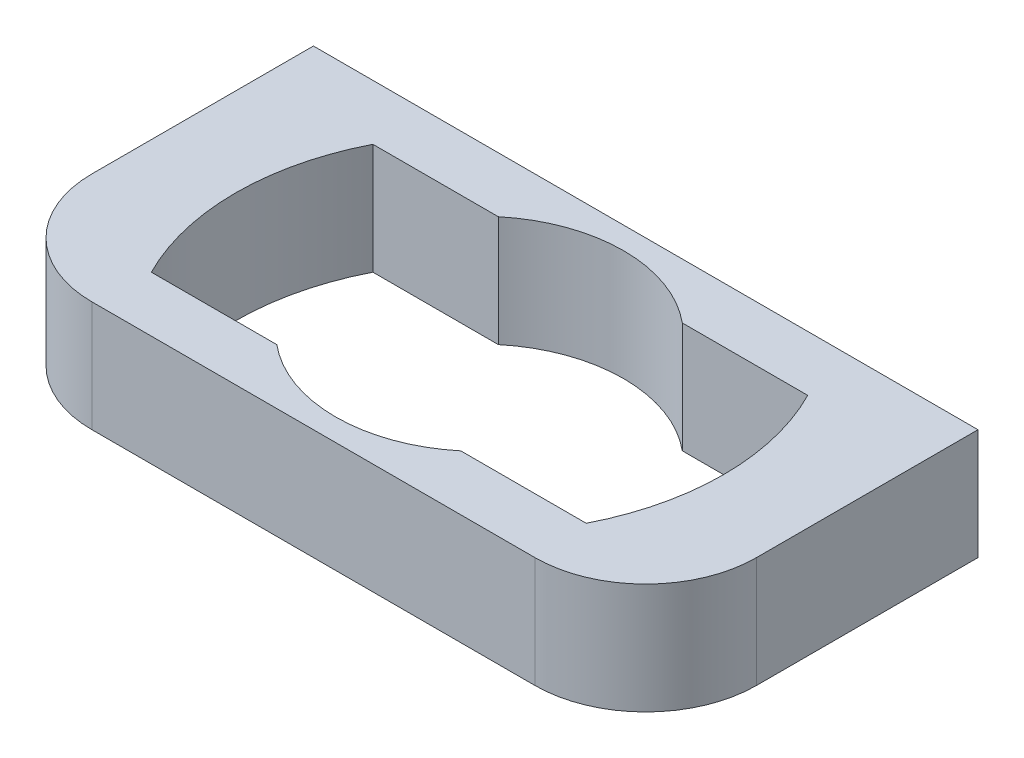
ISO-10303-21;
HEADER;
FILE_DESCRIPTION(('STEP AP214'),'2;1');
FILE_NAME('part.step','',(''),(''),'','','');
FILE_SCHEMA(('AUTOMOTIVE_DESIGN { 1 0 10303 214 1 1 1 1 }'));
ENDSEC;
DATA;
#1=APPLICATION_CONTEXT('core data for automotive mechanical design processes');
#2=APPLICATION_PROTOCOL_DEFINITION('international standard','automotive_design',2000,#1);
#3=PRODUCT_CONTEXT('',#1,'mechanical');
#4=PRODUCT('Part','Part','',(#3));
#5=PRODUCT_RELATED_PRODUCT_CATEGORY('part','',(#4));
#6=PRODUCT_DEFINITION_FORMATION('','',#4);
#7=PRODUCT_DEFINITION_CONTEXT('part definition',#1,'design');
#8=PRODUCT_DEFINITION('design','',#6,#7);
#9=PRODUCT_DEFINITION_SHAPE('','',#8);
#10=(LENGTH_UNIT() NAMED_UNIT(*) SI_UNIT(.MILLI.,.METRE.));
#11=(NAMED_UNIT(*) PLANE_ANGLE_UNIT() SI_UNIT($,.RADIAN.));
#12=(NAMED_UNIT(*) SI_UNIT($,.STERADIAN.) SOLID_ANGLE_UNIT());
#13=UNCERTAINTY_MEASURE_WITH_UNIT(LENGTH_MEASURE(1.E-05),#10,'distance_accuracy_value','');
#14=(GEOMETRIC_REPRESENTATION_CONTEXT(3) GLOBAL_UNCERTAINTY_ASSIGNED_CONTEXT((#13)) GLOBAL_UNIT_ASSIGNED_CONTEXT((#10,
#11,#12)) REPRESENTATION_CONTEXT('',''));
#15=CARTESIAN_POINT('',(0.,0.,0.));
#16=DIRECTION('',(0.,0.,1.));
#17=DIRECTION('',(1.,0.,0.));
#18=AXIS2_PLACEMENT_3D('',#15,#16,#17);
#19=CARTESIAN_POINT('',(0.,10.,0.));
#20=DIRECTION('',(0.,-1.,0.));
#21=DIRECTION('',(0.,0.,-1.));
#22=AXIS2_PLACEMENT_3D('',#19,#20,#21);
#23=CYLINDRICAL_SURFACE('',#22,22.03);
#24=CARTESIAN_POINT('',(0.,0.,0.));
#25=DIRECTION('',(0.,1.,0.));
#26=DIRECTION('',(0.,0.,1.));
#27=AXIS2_PLACEMENT_3D('',#24,#25,#26);
#28=CIRCLE('',#27,22.03);
#29=CARTESIAN_POINT('',(-19.6295924562891,0.,-10.));
#30=VERTEX_POINT('',#29);
#31=CARTESIAN_POINT('',(-19.629592456289,0.,10.));
#32=VERTEX_POINT('',#31);
#33=EDGE_CURVE('E222',#30,#32,#28,.T.);
#34=ORIENTED_EDGE('',*,*,#33,.F.);
#35=DIRECTION('',(0.,-1.,0.));
#36=VECTOR('',#35,1.);
#37=CARTESIAN_POINT('',(-19.6295924562891,10.,-10.));
#38=LINE('',#37,#36);
#39=CARTESIAN_POINT('',(-19.6295924562891,10.,-10.));
#40=VERTEX_POINT('',#39);
#41=EDGE_CURVE('E267',#40,#30,#38,.T.);
#42=ORIENTED_EDGE('',*,*,#41,.F.);
#43=CARTESIAN_POINT('',(0.,10.,0.));
#44=DIRECTION('',(0.,1.,0.));
#45=DIRECTION('',(0.,0.,1.));
#46=AXIS2_PLACEMENT_3D('',#43,#44,#45);
#47=CIRCLE('',#46,22.03);
#48=CARTESIAN_POINT('',(-19.629592456289,10.,10.));
#49=VERTEX_POINT('',#48);
#50=EDGE_CURVE('E184',#40,#49,#47,.T.);
#51=ORIENTED_EDGE('',*,*,#50,.T.);
#52=DIRECTION('',(0.,-1.,0.));
#53=VECTOR('',#52,1.);
#54=CARTESIAN_POINT('',(-19.629592456289,10.,10.));
#55=LINE('',#54,#53);
#56=EDGE_CURVE('E163',#49,#32,#55,.T.);
#57=ORIENTED_EDGE('',*,*,#56,.T.);
#58=EDGE_LOOP('',(#34,#42,#51,#57));
#59=FACE_BOUND('',#58,.T.);
#60=ADVANCED_FACE('F47',(#59),#23,.F.);
#61=CARTESIAN_POINT('',(0.,10.,-10.));
#62=DIRECTION('',(0.,0.,-1.));
#63=DIRECTION('',(-1.,0.,0.));
#64=AXIS2_PLACEMENT_3D('',#61,#62,#63);
#65=PLANE('',#64);
#66=DIRECTION('',(1.,0.,0.));
#67=VECTOR('',#66,1.);
#68=CARTESIAN_POINT('',(0.,0.,-10.));
#69=LINE('',#68,#67);
#70=CARTESIAN_POINT('',(-8.30662386291808,0.,-10.));
#71=VERTEX_POINT('',#70);
#72=EDGE_CURVE('E226',#30,#71,#69,.T.);
#73=ORIENTED_EDGE('',*,*,#72,.T.);
#74=DIRECTION('',(0.,-1.,0.));
#75=VECTOR('',#74,1.);
#76=CARTESIAN_POINT('',(-8.30662386291808,10.,-10.));
#77=LINE('',#76,#75);
#78=CARTESIAN_POINT('',(-8.30662386291808,10.,-10.));
#79=VERTEX_POINT('',#78);
#80=EDGE_CURVE('E264',#79,#71,#77,.T.);
#81=ORIENTED_EDGE('',*,*,#80,.F.);
#82=DIRECTION('',(1.,0.,0.));
#83=VECTOR('',#82,1.);
#84=CARTESIAN_POINT('',(0.,10.,-10.));
#85=LINE('',#84,#83);
#86=EDGE_CURVE('E188',#40,#79,#85,.T.);
#87=ORIENTED_EDGE('',*,*,#86,.F.);
#88=ORIENTED_EDGE('',*,*,#41,.T.);
#89=EDGE_LOOP('',(#73,#81,#87,#88));
#90=FACE_BOUND('',#89,.T.);
#91=ADVANCED_FACE('F315',(#90),#65,.F.);
#92=CARTESIAN_POINT('',(0.,10.,0.));
#93=DIRECTION('',(0.,-1.,0.));
#94=DIRECTION('',(0.,0.,-1.));
#95=AXIS2_PLACEMENT_3D('',#92,#93,#94);
#96=CYLINDRICAL_SURFACE('',#95,13.);
#97=CARTESIAN_POINT('',(0.,0.,0.));
#98=DIRECTION('',(0.,1.,0.));
#99=DIRECTION('',(0.,0.,1.));
#100=AXIS2_PLACEMENT_3D('',#97,#98,#99);
#101=CIRCLE('',#100,13.);
#102=CARTESIAN_POINT('',(8.30662386291808,0.,-10.));
#103=VERTEX_POINT('',#102);
#104=EDGE_CURVE('E230',#103,#71,#101,.T.);
#105=ORIENTED_EDGE('',*,*,#104,.F.);
#106=DIRECTION('',(0.,-1.,0.));
#107=VECTOR('',#106,1.);
#108=CARTESIAN_POINT('',(8.30662386291808,10.,-10.));
#109=LINE('',#108,#107);
#110=CARTESIAN_POINT('',(8.30662386291808,10.,-10.));
#111=VERTEX_POINT('',#110);
#112=EDGE_CURVE('E261',#111,#103,#109,.T.);
#113=ORIENTED_EDGE('',*,*,#112,.F.);
#114=CARTESIAN_POINT('',(0.,10.,0.));
#115=DIRECTION('',(0.,1.,0.));
#116=DIRECTION('',(0.,0.,1.));
#117=AXIS2_PLACEMENT_3D('',#114,#115,#116);
#118=CIRCLE('',#117,13.);
#119=EDGE_CURVE('E191',#111,#79,#118,.T.);
#120=ORIENTED_EDGE('',*,*,#119,.T.);
#121=ORIENTED_EDGE('',*,*,#80,.T.);
#122=EDGE_LOOP('',(#105,#113,#120,#121));
#123=FACE_BOUND('',#122,.T.);
#124=ADVANCED_FACE('F321',(#123),#96,.F.);
#125=CARTESIAN_POINT('',(19.6295924562891,0.,-10.));
#126=VERTEX_POINT('',#125);
#127=EDGE_CURVE('E231',#103,#126,#69,.T.);
#128=ORIENTED_EDGE('',*,*,#127,.T.);
#129=DIRECTION('',(0.,-1.,0.));
#130=VECTOR('',#129,1.);
#131=CARTESIAN_POINT('',(19.6295924562891,10.,-10.));
#132=LINE('',#131,#130);
#133=CARTESIAN_POINT('',(19.6295924562891,10.,-10.));
#134=VERTEX_POINT('',#133);
#135=EDGE_CURVE('E258',#134,#126,#132,.T.);
#136=ORIENTED_EDGE('',*,*,#135,.F.);
#137=EDGE_CURVE('E192',#111,#134,#85,.T.);
#138=ORIENTED_EDGE('',*,*,#137,.F.);
#139=ORIENTED_EDGE('',*,*,#112,.T.);
#140=EDGE_LOOP('',(#128,#136,#138,#139));
#141=FACE_BOUND('',#140,.T.);
#142=ADVANCED_FACE('F324',(#141),#65,.F.);
#143=CARTESIAN_POINT('',(0.,10.,0.));
#144=DIRECTION('',(0.,-1.,0.));
#145=DIRECTION('',(0.,0.,-1.));
#146=AXIS2_PLACEMENT_3D('',#143,#144,#145);
#147=CYLINDRICAL_SURFACE('',#146,22.03);
#148=CARTESIAN_POINT('',(0.,0.,0.));
#149=DIRECTION('',(0.,1.,0.));
#150=DIRECTION('',(0.,0.,1.));
#151=AXIS2_PLACEMENT_3D('',#148,#149,#150);
#152=CIRCLE('',#151,22.03);
#153=CARTESIAN_POINT('',(19.629592456289,0.,10.));
#154=VERTEX_POINT('',#153);
#155=EDGE_CURVE('E235',#154,#126,#152,.T.);
#156=ORIENTED_EDGE('',*,*,#155,.F.);
#157=DIRECTION('',(0.,-1.,0.));
#158=VECTOR('',#157,1.);
#159=CARTESIAN_POINT('',(19.629592456289,10.,10.));
#160=LINE('',#159,#158);
#161=CARTESIAN_POINT('',(19.629592456289,10.,10.));
#162=VERTEX_POINT('',#161);
#163=EDGE_CURVE('E255',#162,#154,#160,.T.);
#164=ORIENTED_EDGE('',*,*,#163,.F.);
#165=CARTESIAN_POINT('',(0.,10.,0.));
#166=DIRECTION('',(0.,1.,0.));
#167=DIRECTION('',(0.,0.,1.));
#168=AXIS2_PLACEMENT_3D('',#165,#166,#167);
#169=CIRCLE('',#168,22.03);
#170=EDGE_CURVE('E196',#162,#134,#169,.T.);
#171=ORIENTED_EDGE('',*,*,#170,.T.);
#172=ORIENTED_EDGE('',*,*,#135,.T.);
#173=EDGE_LOOP('',(#156,#164,#171,#172));
#174=FACE_BOUND('',#173,.T.);
#175=ADVANCED_FACE('F331',(#174),#147,.F.);
#176=CARTESIAN_POINT('',(0.,10.,10.));
#177=DIRECTION('',(0.,0.,-1.));
#178=DIRECTION('',(-1.,0.,0.));
#179=AXIS2_PLACEMENT_3D('',#176,#177,#178);
#180=PLANE('',#179);
#181=DIRECTION('',(1.,0.,0.));
#182=VECTOR('',#181,1.);
#183=CARTESIAN_POINT('',(0.,0.,10.));
#184=LINE('',#183,#182);
#185=CARTESIAN_POINT('',(8.30662386291807,0.,10.));
#186=VERTEX_POINT('',#185);
#187=EDGE_CURVE('E239',#186,#154,#184,.T.);
#188=ORIENTED_EDGE('',*,*,#187,.F.);
#189=DIRECTION('',(0.,-1.,0.));
#190=VECTOR('',#189,1.);
#191=CARTESIAN_POINT('',(8.30662386291807,10.,10.));
#192=LINE('',#191,#190);
#193=CARTESIAN_POINT('',(8.30662386291807,10.,10.));
#194=VERTEX_POINT('',#193);
#195=EDGE_CURVE('E252',#194,#186,#192,.T.);
#196=ORIENTED_EDGE('',*,*,#195,.F.);
#197=DIRECTION('',(1.,0.,0.));
#198=VECTOR('',#197,1.);
#199=CARTESIAN_POINT('',(0.,10.,10.));
#200=LINE('',#199,#198);
#201=EDGE_CURVE('E200',#194,#162,#200,.T.);
#202=ORIENTED_EDGE('',*,*,#201,.T.);
#203=ORIENTED_EDGE('',*,*,#163,.T.);
#204=EDGE_LOOP('',(#188,#196,#202,#203));
#205=FACE_BOUND('',#204,.T.);
#206=ADVANCED_FACE('F335',(#205),#180,.T.);
#207=CARTESIAN_POINT('',(0.,10.,0.));
#208=DIRECTION('',(0.,-1.,0.));
#209=DIRECTION('',(0.,0.,-1.));
#210=AXIS2_PLACEMENT_3D('',#207,#208,#209);
#211=CYLINDRICAL_SURFACE('',#210,13.);
#212=CARTESIAN_POINT('',(0.,0.,0.));
#213=DIRECTION('',(0.,1.,0.));
#214=DIRECTION('',(0.,0.,1.));
#215=AXIS2_PLACEMENT_3D('',#212,#213,#214);
#216=CIRCLE('',#215,13.);
#217=CARTESIAN_POINT('',(-8.30662386291807,0.,10.));
#218=VERTEX_POINT('',#217);
#219=EDGE_CURVE('E243',#218,#186,#216,.T.);
#220=ORIENTED_EDGE('',*,*,#219,.F.);
#221=DIRECTION('',(0.,-1.,0.));
#222=VECTOR('',#221,1.);
#223=CARTESIAN_POINT('',(-8.30662386291807,10.,10.));
#224=LINE('',#223,#222);
#225=CARTESIAN_POINT('',(-8.30662386291807,10.,10.));
#226=VERTEX_POINT('',#225);
#227=EDGE_CURVE('E249',#226,#218,#224,.T.);
#228=ORIENTED_EDGE('',*,*,#227,.F.);
#229=CARTESIAN_POINT('',(0.,10.,0.));
#230=DIRECTION('',(0.,1.,0.));
#231=DIRECTION('',(0.,0.,1.));
#232=AXIS2_PLACEMENT_3D('',#229,#230,#231);
#233=CIRCLE('',#232,13.);
#234=EDGE_CURVE('E204',#226,#194,#233,.T.);
#235=ORIENTED_EDGE('',*,*,#234,.T.);
#236=ORIENTED_EDGE('',*,*,#195,.T.);
#237=EDGE_LOOP('',(#220,#228,#235,#236));
#238=FACE_BOUND('',#237,.T.);
#239=ADVANCED_FACE('F337',(#238),#211,.F.);
#240=CARTESIAN_POINT('',(30.,10.,0.));
#241=DIRECTION('',(1.,0.,0.));
#242=DIRECTION('',(0.,0.,-1.));
#243=AXIS2_PLACEMENT_3D('',#240,#241,#242);
#244=PLANE('',#243);
#245=DIRECTION('',(0.,0.,1.));
#246=VECTOR('',#245,1.);
#247=CARTESIAN_POINT('',(30.,10.,0.));
#248=LINE('',#247,#246);
#249=CARTESIAN_POINT('',(30.,10.,-15.));
#250=VERTEX_POINT('',#249);
#251=CARTESIAN_POINT('',(30.,10.,5.));
#252=VERTEX_POINT('',#251);
#253=EDGE_CURVE('E154',#250,#252,#248,.T.);
#254=ORIENTED_EDGE('',*,*,#253,.T.);
#255=DIRECTION('',(0.,-1.,0.));
#256=VECTOR('',#255,1.);
#257=CARTESIAN_POINT('',(30.,0.,5.));
#258=LINE('',#257,#256);
#259=CARTESIAN_POINT('',(30.,0.,5.));
#260=VERTEX_POINT('',#259);
#261=EDGE_CURVE('E11',#252,#260,#258,.T.);
#262=ORIENTED_EDGE('',*,*,#261,.T.);
#263=DIRECTION('',(0.,0.,1.));
#264=VECTOR('',#263,1.);
#265=CARTESIAN_POINT('',(30.,0.,0.));
#266=LINE('',#265,#264);
#267=CARTESIAN_POINT('',(30.,0.,-15.));
#268=VERTEX_POINT('',#267);
#269=EDGE_CURVE('E157',#268,#260,#266,.T.);
#270=ORIENTED_EDGE('',*,*,#269,.F.);
#271=DIRECTION('',(0.,-1.,0.));
#272=VECTOR('',#271,1.);
#273=CARTESIAN_POINT('',(30.,10.,-15.));
#274=LINE('',#273,#272);
#275=EDGE_CURVE('E152',#250,#268,#274,.T.);
#276=ORIENTED_EDGE('',*,*,#275,.F.);
#277=EDGE_LOOP('',(#254,#262,#270,#276));
#278=FACE_BOUND('',#277,.T.);
#279=ADVANCED_FACE('F153',(#278),#244,.T.);
#280=CARTESIAN_POINT('',(0.,10.,-15.));
#281=DIRECTION('',(0.,0.,-1.));
#282=DIRECTION('',(-1.,0.,0.));
#283=AXIS2_PLACEMENT_3D('',#280,#281,#282);
#284=PLANE('',#283);
#285=CARTESIAN_POINT('',(-25.,5.,-15.));
#286=DIRECTION('',(0.,0.,-1.));
#287=DIRECTION('',(-1.,0.,0.));
#288=AXIS2_PLACEMENT_3D('',#285,#286,#287);
#289=CIRCLE('',#288,2.4);
#290=CARTESIAN_POINT('',(-27.4,5.,-15.));
#291=VERTEX_POINT('',#290);
#292=EDGE_CURVE('E368',#291,#291,#289,.T.);
#293=ORIENTED_EDGE('',*,*,#292,.F.);
#294=EDGE_LOOP('',(#293));
#295=FACE_BOUND('',#294,.T.);
#296=CARTESIAN_POINT('',(25.,4.99999999999999,-15.));
#297=DIRECTION('',(0.,0.,-1.));
#298=DIRECTION('',(-1.,0.,0.));
#299=AXIS2_PLACEMENT_3D('',#296,#297,#298);
#300=CIRCLE('',#299,2.4);
#301=CARTESIAN_POINT('',(22.6,4.99999999999999,-15.));
#302=VERTEX_POINT('',#301);
#303=EDGE_CURVE('E372',#302,#302,#300,.T.);
#304=ORIENTED_EDGE('',*,*,#303,.F.);
#305=EDGE_LOOP('',(#304));
#306=FACE_BOUND('',#305,.T.);
#307=DIRECTION('',(1.,0.,0.));
#308=VECTOR('',#307,1.);
#309=CARTESIAN_POINT('',(0.,0.,-15.));
#310=LINE('',#309,#308);
#311=CARTESIAN_POINT('',(-30.,0.,-15.));
#312=VERTEX_POINT('',#311);
#313=EDGE_CURVE('E211',#312,#268,#310,.T.);
#314=ORIENTED_EDGE('',*,*,#313,.F.);
#315=DIRECTION('',(0.,-1.,0.));
#316=VECTOR('',#315,1.);
#317=CARTESIAN_POINT('',(-30.,10.,-15.));
#318=LINE('',#317,#316);
#319=CARTESIAN_POINT('',(-30.,10.,-15.));
#320=VERTEX_POINT('',#319);
#321=EDGE_CURVE('E164',#320,#312,#318,.T.);
#322=ORIENTED_EDGE('',*,*,#321,.F.);
#323=DIRECTION('',(1.,0.,0.));
#324=VECTOR('',#323,1.);
#325=CARTESIAN_POINT('',(0.,10.,-15.));
#326=LINE('',#325,#324);
#327=EDGE_CURVE('E169',#320,#250,#326,.T.);
#328=ORIENTED_EDGE('',*,*,#327,.T.);
#329=ORIENTED_EDGE('',*,*,#275,.T.);
#330=EDGE_LOOP('',(#314,#322,#328,#329));
#331=FACE_BOUND('',#330,.T.);
#332=ADVANCED_FACE('F173',(#295,#306,#331),#284,.T.);
#333=CARTESIAN_POINT('',(-30.,10.,0.));
#334=DIRECTION('',(1.,0.,0.));
#335=DIRECTION('',(0.,0.,-1.));
#336=AXIS2_PLACEMENT_3D('',#333,#334,#335);
#337=PLANE('',#336);
#338=DIRECTION('',(0.,0.,1.));
#339=VECTOR('',#338,1.);
#340=CARTESIAN_POINT('',(-30.,0.,0.));
#341=LINE('',#340,#339);
#342=CARTESIAN_POINT('',(-30.,0.,5.));
#343=VERTEX_POINT('',#342);
#344=EDGE_CURVE('E215',#312,#343,#341,.T.);
#345=ORIENTED_EDGE('',*,*,#344,.T.);
#346=DIRECTION('',(0.,-1.,0.));
#347=VECTOR('',#346,1.);
#348=CARTESIAN_POINT('',(-30.,10.,5.));
#349=LINE('',#348,#347);
#350=CARTESIAN_POINT('',(-30.,10.,5.));
#351=VERTEX_POINT('',#350);
#352=EDGE_CURVE('E71',#343,#351,#349,.F.);
#353=ORIENTED_EDGE('',*,*,#352,.T.);
#354=DIRECTION('',(0.,0.,1.));
#355=VECTOR('',#354,1.);
#356=CARTESIAN_POINT('',(-30.,10.,0.));
#357=LINE('',#356,#355);
#358=EDGE_CURVE('E175',#320,#351,#357,.T.);
#359=ORIENTED_EDGE('',*,*,#358,.F.);
#360=ORIENTED_EDGE('',*,*,#321,.T.);
#361=EDGE_LOOP('',(#345,#353,#359,#360));
#362=FACE_BOUND('',#361,.T.);
#363=ADVANCED_FACE('F302',(#362),#337,.F.);
#364=CARTESIAN_POINT('',(0.,10.,15.));
#365=DIRECTION('',(0.,0.,-1.));
#366=DIRECTION('',(-1.,0.,0.));
#367=AXIS2_PLACEMENT_3D('',#364,#365,#366);
#368=PLANE('',#367);
#369=DIRECTION('',(1.,0.,0.));
#370=VECTOR('',#369,1.);
#371=CARTESIAN_POINT('',(0.,10.,15.));
#372=LINE('',#371,#370);
#373=CARTESIAN_POINT('',(-20.,10.,15.));
#374=VERTEX_POINT('',#373);
#375=CARTESIAN_POINT('',(20.,10.,15.));
#376=VERTEX_POINT('',#375);
#377=EDGE_CURVE('E178',#374,#376,#372,.T.);
#378=ORIENTED_EDGE('',*,*,#377,.F.);
#379=DIRECTION('',(0.,-1.,0.));
#380=VECTOR('',#379,1.);
#381=CARTESIAN_POINT('',(-20.,10.,15.));
#382=LINE('',#381,#380);
#383=CARTESIAN_POINT('',(-20.,0.,15.));
#384=VERTEX_POINT('',#383);
#385=EDGE_CURVE('E275',#374,#384,#382,.T.);
#386=ORIENTED_EDGE('',*,*,#385,.T.);
#387=DIRECTION('',(1.,0.,0.));
#388=VECTOR('',#387,1.);
#389=CARTESIAN_POINT('',(0.,0.,15.));
#390=LINE('',#389,#388);
#391=CARTESIAN_POINT('',(20.,0.,15.));
#392=VERTEX_POINT('',#391);
#393=EDGE_CURVE('E218',#384,#392,#390,.T.);
#394=ORIENTED_EDGE('',*,*,#393,.T.);
#395=DIRECTION('',(0.,-1.,0.));
#396=VECTOR('',#395,1.);
#397=CARTESIAN_POINT('',(20.,10.,15.));
#398=LINE('',#397,#396);
#399=EDGE_CURVE('E270',#392,#376,#398,.F.);
#400=ORIENTED_EDGE('',*,*,#399,.T.);
#401=EDGE_LOOP('',(#378,#386,#394,#400));
#402=FACE_BOUND('',#401,.T.);
#403=ADVANCED_FACE('F294',(#402),#368,.F.);
#404=EDGE_CURVE('E171',#32,#218,#184,.T.);
#405=ORIENTED_EDGE('',*,*,#404,.F.);
#406=ORIENTED_EDGE('',*,*,#56,.F.);
#407=EDGE_CURVE('E205',#49,#226,#200,.T.);
#408=ORIENTED_EDGE('',*,*,#407,.T.);
#409=ORIENTED_EDGE('',*,*,#227,.T.);
#410=EDGE_LOOP('',(#405,#406,#408,#409));
#411=FACE_BOUND('',#410,.T.);
#412=ADVANCED_FACE('F309',(#411),#180,.T.);
#413=CARTESIAN_POINT('',(0.,10.,0.));
#414=DIRECTION('',(0.,1.,0.));
#415=DIRECTION('',(0.,0.,1.));
#416=AXIS2_PLACEMENT_3D('',#413,#414,#415);
#417=PLANE('',#416);
#418=ORIENTED_EDGE('',*,*,#358,.T.);
#419=CARTESIAN_POINT('',(-20.,10.,5.));
#420=DIRECTION('',(0.,1.,0.));
#421=DIRECTION('',(0.,0.,1.));
#422=AXIS2_PLACEMENT_3D('',#419,#420,#421);
#423=CIRCLE('',#422,10.);
#424=EDGE_CURVE('E56',#351,#374,#423,.T.);
#425=ORIENTED_EDGE('',*,*,#424,.T.);
#426=ORIENTED_EDGE('',*,*,#377,.T.);
#427=CARTESIAN_POINT('',(20.,10.,5.));
#428=DIRECTION('',(0.,1.,0.));
#429=DIRECTION('',(0.,0.,1.));
#430=AXIS2_PLACEMENT_3D('',#427,#428,#429);
#431=CIRCLE('',#430,10.);
#432=EDGE_CURVE('E63',#376,#252,#431,.T.);
#433=ORIENTED_EDGE('',*,*,#432,.T.);
#434=ORIENTED_EDGE('',*,*,#253,.F.);
#435=ORIENTED_EDGE('',*,*,#327,.F.);
#436=EDGE_LOOP('',(#418,#425,#426,#433,#434,#435));
#437=FACE_BOUND('',#436,.T.);
#438=ORIENTED_EDGE('',*,*,#50,.F.);
#439=ORIENTED_EDGE('',*,*,#86,.T.);
#440=ORIENTED_EDGE('',*,*,#119,.F.);
#441=ORIENTED_EDGE('',*,*,#137,.T.);
#442=ORIENTED_EDGE('',*,*,#170,.F.);
#443=ORIENTED_EDGE('',*,*,#201,.F.);
#444=ORIENTED_EDGE('',*,*,#234,.F.);
#445=ORIENTED_EDGE('',*,*,#407,.F.);
#446=EDGE_LOOP('',(#438,#439,#440,#441,#442,#443,#444,#445));
#447=FACE_BOUND('',#446,.T.);
#448=ADVANCED_FACE('F167',(#437,#447),#417,.T.);
#449=CARTESIAN_POINT('',(0.,0.,0.));
#450=DIRECTION('',(0.,1.,0.));
#451=DIRECTION('',(0.,0.,1.));
#452=AXIS2_PLACEMENT_3D('',#449,#450,#451);
#453=PLANE('',#452);
#454=ORIENTED_EDGE('',*,*,#393,.F.);
#455=CARTESIAN_POINT('',(-20.,0.,5.));
#456=DIRECTION('',(0.,1.,0.));
#457=DIRECTION('',(0.,0.,1.));
#458=AXIS2_PLACEMENT_3D('',#455,#456,#457);
#459=CIRCLE('',#458,10.);
#460=EDGE_CURVE('E282',#384,#343,#459,.F.);
#461=ORIENTED_EDGE('',*,*,#460,.T.);
#462=ORIENTED_EDGE('',*,*,#344,.F.);
#463=ORIENTED_EDGE('',*,*,#313,.T.);
#464=ORIENTED_EDGE('',*,*,#269,.T.);
#465=CARTESIAN_POINT('',(20.,0.,5.));
#466=DIRECTION('',(0.,1.,0.));
#467=DIRECTION('',(0.,0.,1.));
#468=AXIS2_PLACEMENT_3D('',#465,#466,#467);
#469=CIRCLE('',#468,10.);
#470=EDGE_CURVE('E279',#260,#392,#469,.F.);
#471=ORIENTED_EDGE('',*,*,#470,.T.);
#472=EDGE_LOOP('',(#454,#461,#462,#463,#464,#471));
#473=FACE_BOUND('',#472,.T.);
#474=ORIENTED_EDGE('',*,*,#33,.T.);
#475=ORIENTED_EDGE('',*,*,#404,.T.);
#476=ORIENTED_EDGE('',*,*,#219,.T.);
#477=ORIENTED_EDGE('',*,*,#187,.T.);
#478=ORIENTED_EDGE('',*,*,#155,.T.);
#479=ORIENTED_EDGE('',*,*,#127,.F.);
#480=ORIENTED_EDGE('',*,*,#104,.T.);
#481=ORIENTED_EDGE('',*,*,#72,.F.);
#482=EDGE_LOOP('',(#474,#475,#476,#477,#478,#479,#480,#481));
#483=FACE_BOUND('',#482,.T.);
#484=ADVANCED_FACE('F300',(#473,#483),#453,.F.);
#485=CARTESIAN_POINT('',(-20.,10.,5.));
#486=DIRECTION('',(0.,-1.,0.));
#487=DIRECTION('',(0.,0.,-1.));
#488=AXIS2_PLACEMENT_3D('',#485,#486,#487);
#489=CYLINDRICAL_SURFACE('',#488,10.);
#490=ORIENTED_EDGE('',*,*,#424,.F.);
#491=ORIENTED_EDGE('',*,*,#352,.F.);
#492=ORIENTED_EDGE('',*,*,#460,.F.);
#493=ORIENTED_EDGE('',*,*,#385,.F.);
#494=EDGE_LOOP('',(#490,#491,#492,#493));
#495=FACE_BOUND('',#494,.T.);
#496=ADVANCED_FACE('F297',(#495),#489,.T.);
#497=CARTESIAN_POINT('',(20.,10.,5.));
#498=DIRECTION('',(0.,1.,0.));
#499=DIRECTION('',(0.,0.,1.));
#500=AXIS2_PLACEMENT_3D('',#497,#498,#499);
#501=CYLINDRICAL_SURFACE('',#500,10.);
#502=ORIENTED_EDGE('',*,*,#432,.F.);
#503=ORIENTED_EDGE('',*,*,#399,.F.);
#504=ORIENTED_EDGE('',*,*,#470,.F.);
#505=ORIENTED_EDGE('',*,*,#261,.F.);
#506=EDGE_LOOP('',(#502,#503,#504,#505));
#507=FACE_BOUND('',#506,.T.);
#508=ADVANCED_FACE('F49',(#507),#501,.T.);
#509=CARTESIAN_POINT('',(25.,4.99999999999999,-9.));
#510=DIRECTION('',(0.,0.,-1.));
#511=DIRECTION('',(-1.,0.,0.));
#512=AXIS2_PLACEMENT_3D('',#509,#510,#511);
#513=CYLINDRICAL_SURFACE('',#512,2.4);
#514=CARTESIAN_POINT('',(25.,4.99999999999999,-9.));
#515=DIRECTION('',(0.,0.,-1.));
#516=DIRECTION('',(-1.,0.,0.));
#517=AXIS2_PLACEMENT_3D('',#514,#515,#516);
#518=CIRCLE('',#517,2.4);
#519=CARTESIAN_POINT('',(22.6,4.99999999999999,-9.));
#520=VERTEX_POINT('',#519);
#521=EDGE_CURVE('E377',#520,#520,#518,.T.);
#522=ORIENTED_EDGE('',*,*,#521,.F.);
#523=EDGE_LOOP('',(#522));
#524=FACE_BOUND('',#523,.T.);
#525=ORIENTED_EDGE('',*,*,#303,.T.);
#526=EDGE_LOOP('',(#525));
#527=FACE_BOUND('',#526,.T.);
#528=ADVANCED_FACE('F352',(#524,#527),#513,.F.);
#529=CARTESIAN_POINT('',(25.,4.99999999999999,-9.));
#530=DIRECTION('',(0.,0.,-1.));
#531=DIRECTION('',(-1.,0.,0.));
#532=AXIS2_PLACEMENT_3D('',#529,#530,#531);
#533=PLANE('',#532);
#534=ORIENTED_EDGE('',*,*,#521,.T.);
#535=EDGE_LOOP('',(#534));
#536=FACE_BOUND('',#535,.T.);
#537=ADVANCED_FACE('F348',(#536),#533,.T.);
#538=CARTESIAN_POINT('',(-25.,5.,-9.));
#539=DIRECTION('',(0.,0.,-1.));
#540=DIRECTION('',(-1.,0.,0.));
#541=AXIS2_PLACEMENT_3D('',#538,#539,#540);
#542=CYLINDRICAL_SURFACE('',#541,2.4);
#543=CARTESIAN_POINT('',(-25.,5.,-9.));
#544=DIRECTION('',(0.,0.,-1.));
#545=DIRECTION('',(-1.,0.,0.));
#546=AXIS2_PLACEMENT_3D('',#543,#544,#545);
#547=CIRCLE('',#546,2.4);
#548=CARTESIAN_POINT('',(-27.4,5.,-9.));
#549=VERTEX_POINT('',#548);
#550=EDGE_CURVE('E212',#549,#549,#547,.T.);
#551=ORIENTED_EDGE('',*,*,#550,.F.);
#552=EDGE_LOOP('',(#551));
#553=FACE_BOUND('',#552,.T.);
#554=ORIENTED_EDGE('',*,*,#292,.T.);
#555=EDGE_LOOP('',(#554));
#556=FACE_BOUND('',#555,.T.);
#557=ADVANCED_FACE('F351',(#553,#556),#542,.F.);
#558=CARTESIAN_POINT('',(-25.,5.,-9.));
#559=DIRECTION('',(0.,0.,-1.));
#560=DIRECTION('',(-1.,0.,0.));
#561=AXIS2_PLACEMENT_3D('',#558,#559,#560);
#562=PLANE('',#561);
#563=ORIENTED_EDGE('',*,*,#550,.T.);
#564=EDGE_LOOP('',(#563));
#565=FACE_BOUND('',#564,.T.);
#566=ADVANCED_FACE('F359',(#565),#562,.T.);
#567=CLOSED_SHELL('',(#60,#91,#124,#142,#175,#206,#239,#279,#332,#363,#403,#412,#448,#484,#496,
#508,#528,#537,#557,#566));
#568=MANIFOLD_SOLID_BREP('B2',#567);
#569=ADVANCED_BREP_SHAPE_REPRESENTATION('',(#18,#568),#14);
#570=SHAPE_DEFINITION_REPRESENTATION(#9,#569);
ENDSEC;
END-ISO-10303-21;
